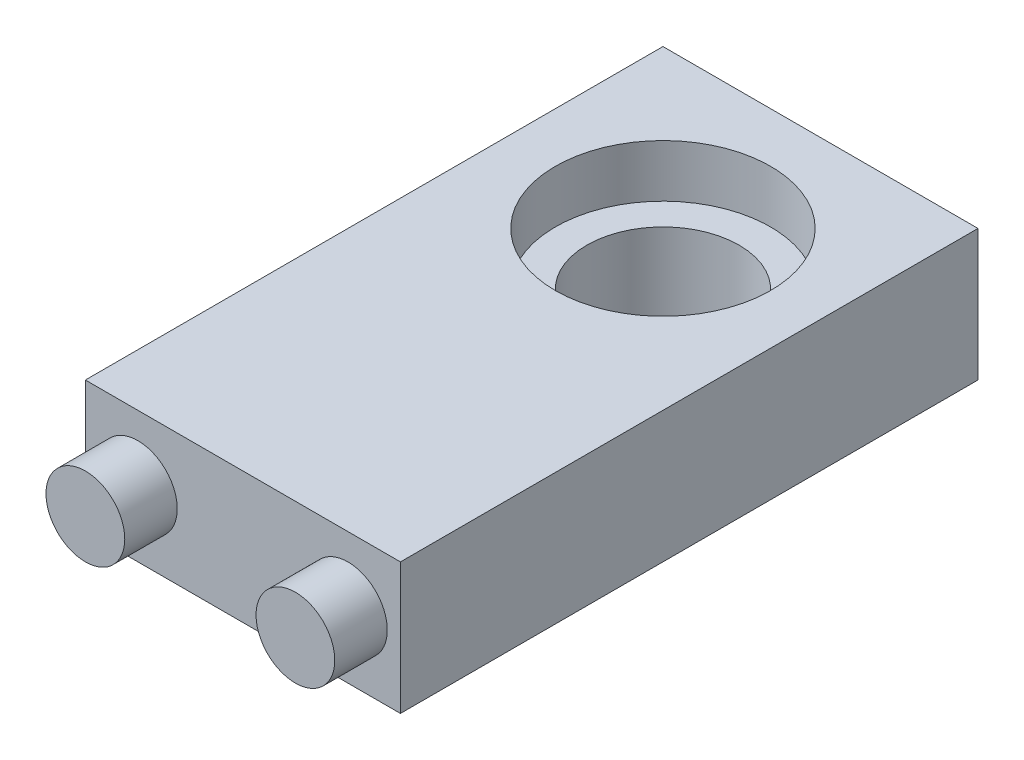
ISO-10303-21;
HEADER;
FILE_DESCRIPTION(('STEP AP214'),'2;1');
FILE_NAME('part.step','',(''),(''),'','','');
FILE_SCHEMA(('AUTOMOTIVE_DESIGN { 1 0 10303 214 1 1 1 1 }'));
ENDSEC;
DATA;
#1=APPLICATION_CONTEXT('core data for automotive mechanical design processes');
#2=APPLICATION_PROTOCOL_DEFINITION('international standard','automotive_design',2000,#1);
#3=PRODUCT_CONTEXT('',#1,'mechanical');
#4=PRODUCT('Part','Part','',(#3));
#5=PRODUCT_RELATED_PRODUCT_CATEGORY('part','',(#4));
#6=PRODUCT_DEFINITION_FORMATION('','',#4);
#7=PRODUCT_DEFINITION_CONTEXT('part definition',#1,'design');
#8=PRODUCT_DEFINITION('design','',#6,#7);
#9=PRODUCT_DEFINITION_SHAPE('','',#8);
#10=(LENGTH_UNIT() NAMED_UNIT(*) SI_UNIT(.MILLI.,.METRE.));
#11=(NAMED_UNIT(*) PLANE_ANGLE_UNIT() SI_UNIT($,.RADIAN.));
#12=(NAMED_UNIT(*) SI_UNIT($,.STERADIAN.) SOLID_ANGLE_UNIT());
#13=UNCERTAINTY_MEASURE_WITH_UNIT(LENGTH_MEASURE(1.E-05),#10,'distance_accuracy_value','');
#14=(GEOMETRIC_REPRESENTATION_CONTEXT(3) GLOBAL_UNCERTAINTY_ASSIGNED_CONTEXT((#13)) GLOBAL_UNIT_ASSIGNED_CONTEXT((#10,
#11,#12)) REPRESENTATION_CONTEXT('',''));
#15=CARTESIAN_POINT('',(0.,0.,0.));
#16=DIRECTION('',(0.,0.,1.));
#17=DIRECTION('',(1.,0.,0.));
#18=AXIS2_PLACEMENT_3D('',#15,#16,#17);
#19=CARTESIAN_POINT('',(0.,3.,0.));
#20=DIRECTION('',(0.,1.,0.));
#21=DIRECTION('',(0.,0.,1.));
#22=AXIS2_PLACEMENT_3D('',#19,#20,#21);
#23=PLANE('',#22);
#24=CARTESIAN_POINT('',(6.,3.,-16.));
#25=DIRECTION('',(0.,1.,0.));
#26=DIRECTION('',(0.,0.,1.));
#27=AXIS2_PLACEMENT_3D('',#24,#25,#26);
#28=CIRCLE('',#27,2.9);
#29=CARTESIAN_POINT('',(6.,3.,-13.1));
#30=VERTEX_POINT('',#29);
#31=EDGE_CURVE('E147',#30,#30,#28,.T.);
#32=ORIENTED_EDGE('',*,*,#31,.F.);
#33=EDGE_LOOP('',(#32));
#34=FACE_BOUND('',#33,.T.);
#35=CARTESIAN_POINT('',(6.,3.,-16.));
#36=DIRECTION('',(0.,1.,0.));
#37=DIRECTION('',(0.,0.,1.));
#38=AXIS2_PLACEMENT_3D('',#35,#36,#37);
#39=CIRCLE('',#38,4.1);
#40=CARTESIAN_POINT('',(6.,3.,-11.9));
#41=VERTEX_POINT('',#40);
#42=EDGE_CURVE('E134',#41,#41,#39,.T.);
#43=ORIENTED_EDGE('',*,*,#42,.T.);
#44=EDGE_LOOP('',(#43));
#45=FACE_BOUND('',#44,.T.);
#46=ADVANCED_FACE('F62',(#34,#45),#23,.T.);
#47=CARTESIAN_POINT('',(0.,0.,0.));
#48=DIRECTION('',(0.,1.,0.));
#49=DIRECTION('',(0.,0.,1.));
#50=AXIS2_PLACEMENT_3D('',#47,#48,#49);
#51=PLANE('',#50);
#52=DIRECTION('',(1.,0.,0.));
#53=VECTOR('',#52,1.);
#54=CARTESIAN_POINT('',(0.,0.,-22.));
#55=LINE('',#54,#53);
#56=CARTESIAN_POINT('',(0.,0.,-22.));
#57=VERTEX_POINT('',#56);
#58=CARTESIAN_POINT('',(12.,0.,-22.));
#59=VERTEX_POINT('',#58);
#60=EDGE_CURVE('E151',#57,#59,#55,.T.);
#61=ORIENTED_EDGE('',*,*,#60,.T.);
#62=DIRECTION('',(0.,0.,-1.));
#63=VECTOR('',#62,1.);
#64=CARTESIAN_POINT('',(12.,0.,0.));
#65=LINE('',#64,#63);
#66=CARTESIAN_POINT('',(12.,0.,0.));
#67=VERTEX_POINT('',#66);
#68=EDGE_CURVE('E112',#67,#59,#65,.T.);
#69=ORIENTED_EDGE('',*,*,#68,.F.);
#70=DIRECTION('',(1.,0.,0.));
#71=VECTOR('',#70,1.);
#72=CARTESIAN_POINT('',(0.,0.,0.));
#73=LINE('',#72,#71);
#74=CARTESIAN_POINT('',(0.,0.,0.));
#75=VERTEX_POINT('',#74);
#76=EDGE_CURVE('E159',#75,#67,#73,.T.);
#77=ORIENTED_EDGE('',*,*,#76,.F.);
#78=DIRECTION('',(0.,0.,-1.));
#79=VECTOR('',#78,1.);
#80=CARTESIAN_POINT('',(0.,0.,0.));
#81=LINE('',#80,#79);
#82=EDGE_CURVE('E117',#75,#57,#81,.T.);
#83=ORIENTED_EDGE('',*,*,#82,.T.);
#84=EDGE_LOOP('',(#61,#69,#77,#83));
#85=FACE_BOUND('',#84,.T.);
#86=CARTESIAN_POINT('',(6.,0.,-16.));
#87=DIRECTION('',(0.,1.,0.));
#88=DIRECTION('',(0.,0.,1.));
#89=AXIS2_PLACEMENT_3D('',#86,#87,#88);
#90=CIRCLE('',#89,2.9);
#91=CARTESIAN_POINT('',(6.,0.,-13.1));
#92=VERTEX_POINT('',#91);
#93=EDGE_CURVE('E142',#92,#92,#90,.T.);
#94=ORIENTED_EDGE('',*,*,#93,.T.);
#95=EDGE_LOOP('',(#94));
#96=FACE_BOUND('',#95,.T.);
#97=ADVANCED_FACE('F182',(#85,#96),#51,.F.);
#98=CARTESIAN_POINT('',(0.,3.,-22.));
#99=DIRECTION('',(0.,0.,-1.));
#100=DIRECTION('',(-1.,0.,0.));
#101=AXIS2_PLACEMENT_3D('',#98,#99,#100);
#102=PLANE('',#101);
#103=ORIENTED_EDGE('',*,*,#60,.F.);
#104=DIRECTION('',(0.,-1.,0.));
#105=VECTOR('',#104,1.);
#106=CARTESIAN_POINT('',(0.,3.,-22.));
#107=LINE('',#106,#105);
#108=CARTESIAN_POINT('',(0.,5.,-22.));
#109=VERTEX_POINT('',#108);
#110=EDGE_CURVE('E78',#109,#57,#107,.T.);
#111=ORIENTED_EDGE('',*,*,#110,.F.);
#112=DIRECTION('',(-1.,0.,0.));
#113=VECTOR('',#112,1.);
#114=CARTESIAN_POINT('',(0.,5.,-22.));
#115=LINE('',#114,#113);
#116=CARTESIAN_POINT('',(12.,5.,-22.));
#117=VERTEX_POINT('',#116);
#118=EDGE_CURVE('E120',#117,#109,#115,.T.);
#119=ORIENTED_EDGE('',*,*,#118,.F.);
#120=DIRECTION('',(0.,-1.,0.));
#121=VECTOR('',#120,1.);
#122=CARTESIAN_POINT('',(12.,3.,-22.));
#123=LINE('',#122,#121);
#124=EDGE_CURVE('E105',#117,#59,#123,.T.);
#125=ORIENTED_EDGE('',*,*,#124,.T.);
#126=EDGE_LOOP('',(#103,#111,#119,#125));
#127=FACE_BOUND('',#126,.T.);
#128=ADVANCED_FACE('F64',(#127),#102,.T.);
#129=CARTESIAN_POINT('',(0.,3.,0.));
#130=DIRECTION('',(-1.,0.,0.));
#131=DIRECTION('',(0.,0.,1.));
#132=AXIS2_PLACEMENT_3D('',#129,#130,#131);
#133=PLANE('',#132);
#134=ORIENTED_EDGE('',*,*,#82,.F.);
#135=DIRECTION('',(0.,-1.,0.));
#136=VECTOR('',#135,1.);
#137=CARTESIAN_POINT('',(0.,3.,0.));
#138=LINE('',#137,#136);
#139=CARTESIAN_POINT('',(0.,5.,0.));
#140=VERTEX_POINT('',#139);
#141=EDGE_CURVE('E86',#140,#75,#138,.T.);
#142=ORIENTED_EDGE('',*,*,#141,.F.);
#143=DIRECTION('',(0.,0.,1.));
#144=VECTOR('',#143,1.);
#145=CARTESIAN_POINT('',(0.,5.,0.));
#146=LINE('',#145,#144);
#147=EDGE_CURVE('E124',#109,#140,#146,.T.);
#148=ORIENTED_EDGE('',*,*,#147,.F.);
#149=ORIENTED_EDGE('',*,*,#110,.T.);
#150=EDGE_LOOP('',(#134,#142,#148,#149));
#151=FACE_BOUND('',#150,.T.);
#152=ADVANCED_FACE('F178',(#151),#133,.T.);
#153=CARTESIAN_POINT('',(0.,3.,0.));
#154=DIRECTION('',(0.,0.,-1.));
#155=DIRECTION('',(-1.,0.,0.));
#156=AXIS2_PLACEMENT_3D('',#153,#154,#155);
#157=PLANE('',#156);
#158=CARTESIAN_POINT('',(2.,2.5,0.));
#159=DIRECTION('',(0.,0.,-1.));
#160=DIRECTION('',(-1.,0.,0.));
#161=AXIS2_PLACEMENT_3D('',#158,#159,#160);
#162=CIRCLE('',#161,1.5);
#163=CARTESIAN_POINT('',(0.5,2.5,0.));
#164=VERTEX_POINT('',#163);
#165=EDGE_CURVE('E12',#164,#164,#162,.F.);
#166=ORIENTED_EDGE('',*,*,#165,.F.);
#167=EDGE_LOOP('',(#166));
#168=FACE_BOUND('',#167,.T.);
#169=CARTESIAN_POINT('',(10.,2.5,0.));
#170=DIRECTION('',(0.,0.,-1.));
#171=DIRECTION('',(-1.,0.,0.));
#172=AXIS2_PLACEMENT_3D('',#169,#170,#171);
#173=CIRCLE('',#172,1.5);
#174=CARTESIAN_POINT('',(8.5,2.5,0.));
#175=VERTEX_POINT('',#174);
#176=EDGE_CURVE('E71',#175,#175,#173,.F.);
#177=ORIENTED_EDGE('',*,*,#176,.F.);
#178=EDGE_LOOP('',(#177));
#179=FACE_BOUND('',#178,.T.);
#180=ORIENTED_EDGE('',*,*,#76,.T.);
#181=DIRECTION('',(0.,-1.,0.));
#182=VECTOR('',#181,1.);
#183=CARTESIAN_POINT('',(12.,3.,0.));
#184=LINE('',#183,#182);
#185=CARTESIAN_POINT('',(12.,5.,0.));
#186=VERTEX_POINT('',#185);
#187=EDGE_CURVE('E116',#186,#67,#184,.T.);
#188=ORIENTED_EDGE('',*,*,#187,.F.);
#189=DIRECTION('',(1.,0.,0.));
#190=VECTOR('',#189,1.);
#191=CARTESIAN_POINT('',(0.,5.,0.));
#192=LINE('',#191,#190);
#193=EDGE_CURVE('E128',#140,#186,#192,.T.);
#194=ORIENTED_EDGE('',*,*,#193,.F.);
#195=ORIENTED_EDGE('',*,*,#141,.T.);
#196=EDGE_LOOP('',(#180,#188,#194,#195));
#197=FACE_BOUND('',#196,.T.);
#198=ADVANCED_FACE('F176',(#168,#179,#197),#157,.F.);
#199=CARTESIAN_POINT('',(12.,3.,0.));
#200=DIRECTION('',(-1.,0.,0.));
#201=DIRECTION('',(0.,0.,1.));
#202=AXIS2_PLACEMENT_3D('',#199,#200,#201);
#203=PLANE('',#202);
#204=ORIENTED_EDGE('',*,*,#68,.T.);
#205=ORIENTED_EDGE('',*,*,#124,.F.);
#206=DIRECTION('',(0.,0.,-1.));
#207=VECTOR('',#206,1.);
#208=CARTESIAN_POINT('',(12.,5.,0.));
#209=LINE('',#208,#207);
#210=EDGE_CURVE('E110',#186,#117,#209,.T.);
#211=ORIENTED_EDGE('',*,*,#210,.F.);
#212=ORIENTED_EDGE('',*,*,#187,.T.);
#213=EDGE_LOOP('',(#204,#205,#211,#212));
#214=FACE_BOUND('',#213,.T.);
#215=ADVANCED_FACE('F107',(#214),#203,.F.);
#216=CARTESIAN_POINT('',(6.,3.,-16.));
#217=DIRECTION('',(0.,-1.,0.));
#218=DIRECTION('',(0.,0.,-1.));
#219=AXIS2_PLACEMENT_3D('',#216,#217,#218);
#220=CYLINDRICAL_SURFACE('',#219,2.9);
#221=ORIENTED_EDGE('',*,*,#31,.T.);
#222=EDGE_LOOP('',(#221));
#223=FACE_BOUND('',#222,.T.);
#224=ORIENTED_EDGE('',*,*,#93,.F.);
#225=EDGE_LOOP('',(#224));
#226=FACE_BOUND('',#225,.T.);
#227=ADVANCED_FACE('F201',(#223,#226),#220,.F.);
#228=CARTESIAN_POINT('',(6.,5.,-16.));
#229=DIRECTION('',(0.,-1.,0.));
#230=DIRECTION('',(0.,0.,-1.));
#231=AXIS2_PLACEMENT_3D('',#228,#229,#230);
#232=CYLINDRICAL_SURFACE('',#231,4.1);
#233=CARTESIAN_POINT('',(6.,5.,-16.));
#234=DIRECTION('',(0.,1.,0.));
#235=DIRECTION('',(0.,0.,1.));
#236=AXIS2_PLACEMENT_3D('',#233,#234,#235);
#237=CIRCLE('',#236,4.1);
#238=CARTESIAN_POINT('',(6.,5.,-11.9));
#239=VERTEX_POINT('',#238);
#240=EDGE_CURVE('E130',#239,#239,#237,.T.);
#241=ORIENTED_EDGE('',*,*,#240,.T.);
#242=EDGE_LOOP('',(#241));
#243=FACE_BOUND('',#242,.T.);
#244=ORIENTED_EDGE('',*,*,#42,.F.);
#245=EDGE_LOOP('',(#244));
#246=FACE_BOUND('',#245,.T.);
#247=ADVANCED_FACE('F203',(#243,#246),#232,.F.);
#248=CARTESIAN_POINT('',(0.,5.,0.));
#249=DIRECTION('',(0.,1.,0.));
#250=DIRECTION('',(0.,0.,1.));
#251=AXIS2_PLACEMENT_3D('',#248,#249,#250);
#252=PLANE('',#251);
#253=ORIENTED_EDGE('',*,*,#240,.F.);
#254=EDGE_LOOP('',(#253));
#255=FACE_BOUND('',#254,.T.);
#256=ORIENTED_EDGE('',*,*,#210,.T.);
#257=ORIENTED_EDGE('',*,*,#118,.T.);
#258=ORIENTED_EDGE('',*,*,#147,.T.);
#259=ORIENTED_EDGE('',*,*,#193,.T.);
#260=EDGE_LOOP('',(#256,#257,#258,#259));
#261=FACE_BOUND('',#260,.T.);
#262=ADVANCED_FACE('F127',(#255,#261),#252,.T.);
#263=CARTESIAN_POINT('',(10.,2.5,2.));
#264=DIRECTION('',(0.,0.,-1.));
#265=DIRECTION('',(-1.,0.,0.));
#266=AXIS2_PLACEMENT_3D('',#263,#264,#265);
#267=CYLINDRICAL_SURFACE('',#266,1.5);
#268=CARTESIAN_POINT('',(10.,2.5,2.));
#269=DIRECTION('',(0.,0.,1.));
#270=DIRECTION('',(-1.,0.,0.));
#271=AXIS2_PLACEMENT_3D('',#268,#269,#270);
#272=CIRCLE('',#271,1.5);
#273=CARTESIAN_POINT('',(8.5,2.5,2.));
#274=VERTEX_POINT('',#273);
#275=EDGE_CURVE('E230',#274,#274,#272,.T.);
#276=ORIENTED_EDGE('',*,*,#275,.F.);
#277=EDGE_LOOP('',(#276));
#278=FACE_BOUND('',#277,.T.);
#279=ORIENTED_EDGE('',*,*,#176,.T.);
#280=EDGE_LOOP('',(#279));
#281=FACE_BOUND('',#280,.T.);
#282=ADVANCED_FACE('F174',(#278,#281),#267,.T.);
#283=CARTESIAN_POINT('',(10.,2.5,2.));
#284=DIRECTION('',(0.,0.,-1.));
#285=DIRECTION('',(-1.,0.,0.));
#286=AXIS2_PLACEMENT_3D('',#283,#284,#285);
#287=PLANE('',#286);
#288=ORIENTED_EDGE('',*,*,#275,.T.);
#289=EDGE_LOOP('',(#288));
#290=FACE_BOUND('',#289,.T.);
#291=ADVANCED_FACE('F211',(#290),#287,.F.);
#292=CARTESIAN_POINT('',(2.,2.5,2.));
#293=DIRECTION('',(0.,0.,-1.));
#294=DIRECTION('',(-1.,0.,0.));
#295=AXIS2_PLACEMENT_3D('',#292,#293,#294);
#296=CYLINDRICAL_SURFACE('',#295,1.5);
#297=CARTESIAN_POINT('',(2.,2.5,2.));
#298=DIRECTION('',(0.,0.,1.));
#299=DIRECTION('',(1.,0.,0.));
#300=AXIS2_PLACEMENT_3D('',#297,#298,#299);
#301=CIRCLE('',#300,1.5);
#302=CARTESIAN_POINT('',(3.5,2.5,2.));
#303=VERTEX_POINT('',#302);
#304=EDGE_CURVE('E146',#303,#303,#301,.T.);
#305=ORIENTED_EDGE('',*,*,#304,.F.);
#306=EDGE_LOOP('',(#305));
#307=FACE_BOUND('',#306,.T.);
#308=ORIENTED_EDGE('',*,*,#165,.T.);
#309=EDGE_LOOP('',(#308));
#310=FACE_BOUND('',#309,.T.);
#311=ADVANCED_FACE('F214',(#307,#310),#296,.T.);
#312=CARTESIAN_POINT('',(2.,2.5,2.));
#313=DIRECTION('',(0.,0.,1.));
#314=DIRECTION('',(1.,0.,0.));
#315=AXIS2_PLACEMENT_3D('',#312,#313,#314);
#316=PLANE('',#315);
#317=ORIENTED_EDGE('',*,*,#304,.T.);
#318=EDGE_LOOP('',(#317));
#319=FACE_BOUND('',#318,.T.);
#320=ADVANCED_FACE('F221',(#319),#316,.T.);
#321=CLOSED_SHELL('',(#46,#97,#128,#152,#198,#215,#227,#247,#262,#282,#291,#311,#320));
#322=MANIFOLD_SOLID_BREP('B2',#321);
#323=ADVANCED_BREP_SHAPE_REPRESENTATION('',(#18,#322),#14);
#324=SHAPE_DEFINITION_REPRESENTATION(#9,#323);
ENDSEC;
END-ISO-10303-21;
